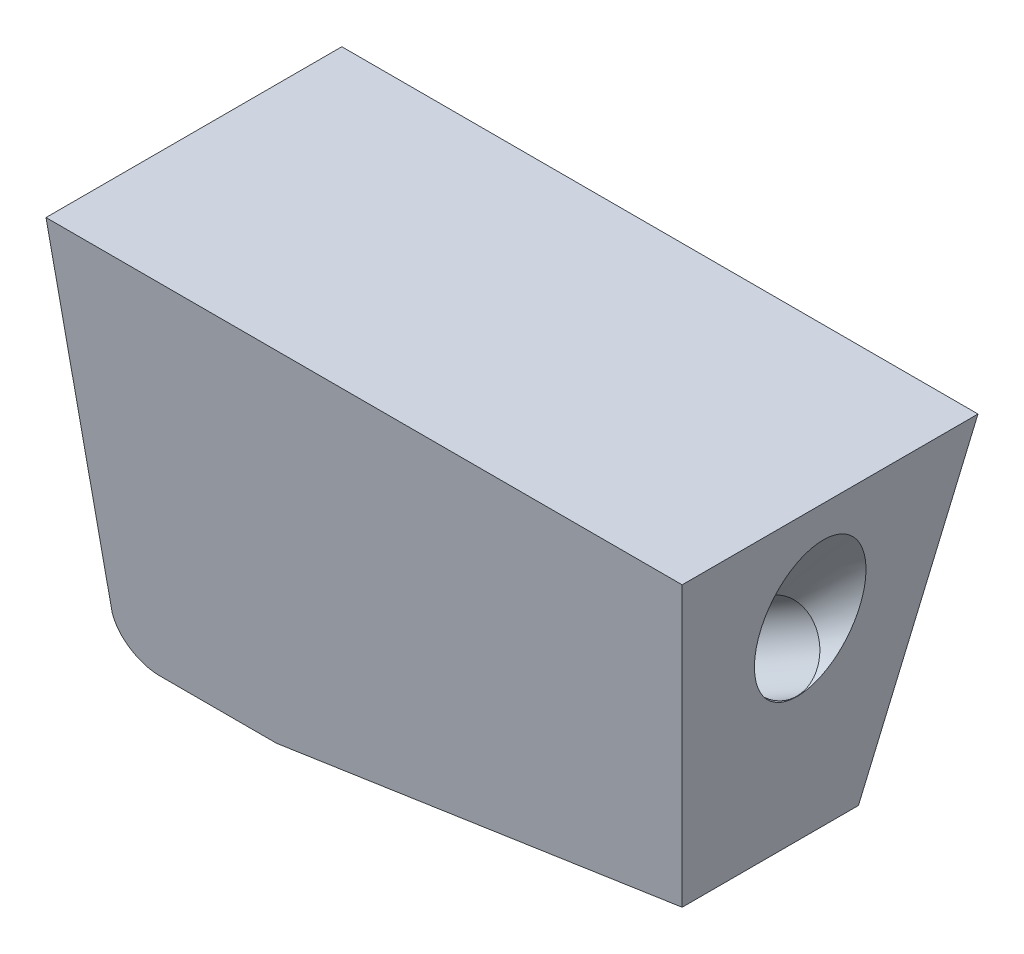
ISO-10303-21;
HEADER;
FILE_DESCRIPTION(('STEP AP214'),'2;1');
FILE_NAME('part.step','',(''),(''),'','','');
FILE_SCHEMA(('AUTOMOTIVE_DESIGN { 1 0 10303 214 1 1 1 1 }'));
ENDSEC;
DATA;
#1=APPLICATION_CONTEXT('core data for automotive mechanical design processes');
#2=APPLICATION_PROTOCOL_DEFINITION('international standard','automotive_design',2000,#1);
#3=PRODUCT_CONTEXT('',#1,'mechanical');
#4=PRODUCT('Part','Part','',(#3));
#5=PRODUCT_RELATED_PRODUCT_CATEGORY('part','',(#4));
#6=PRODUCT_DEFINITION_FORMATION('','',#4);
#7=PRODUCT_DEFINITION_CONTEXT('part definition',#1,'design');
#8=PRODUCT_DEFINITION('design','',#6,#7);
#9=PRODUCT_DEFINITION_SHAPE('','',#8);
#10=(LENGTH_UNIT() NAMED_UNIT(*) SI_UNIT(.MILLI.,.METRE.));
#11=(NAMED_UNIT(*) PLANE_ANGLE_UNIT() SI_UNIT($,.RADIAN.));
#12=(NAMED_UNIT(*) SI_UNIT($,.STERADIAN.) SOLID_ANGLE_UNIT());
#13=UNCERTAINTY_MEASURE_WITH_UNIT(LENGTH_MEASURE(1.E-05),#10,'distance_accuracy_value','');
#14=(GEOMETRIC_REPRESENTATION_CONTEXT(3) GLOBAL_UNCERTAINTY_ASSIGNED_CONTEXT((#13)) GLOBAL_UNIT_ASSIGNED_CONTEXT((#10,
#11,#12)) REPRESENTATION_CONTEXT('',''));
#15=CARTESIAN_POINT('',(0.,0.,0.));
#16=DIRECTION('',(0.,0.,1.));
#17=DIRECTION('',(1.,0.,0.));
#18=AXIS2_PLACEMENT_3D('',#15,#16,#17);
#19=CARTESIAN_POINT('',(38.0505893023531,0.,0.0508));
#20=DIRECTION('',(0.,-0.173648177666931,0.984807753012208));
#21=DIRECTION('',(0.,-0.984807753012208,-0.173648177666931));
#22=AXIS2_PLACEMENT_3D('',#19,#20,#21);
#23=PLANE('',#22);
#24=DIRECTION('',(-0.171087869746036,-0.970287525247814,-0.171087869746036));
#25=VECTOR('',#24,1.);
#26=CARTESIAN_POINT('',(1.11871235410314,6.31572292356323,1.16443235410315));
#27=LINE('',#26,#25);
#28=CARTESIAN_POINT('',(0.0543151661605584,0.279226502732241,0.100035166160561));
#29=VERTEX_POINT('',#28);
#30=CARTESIAN_POINT('',(0.013882623272793,0.0499221573319521,0.059602623272796));
#31=VERTEX_POINT('',#30);
#32=EDGE_CURVE('E433',#29,#31,#27,.T.);
#33=ORIENTED_EDGE('',*,*,#32,.F.);
#34=DIRECTION('',(-1.,0.,0.));
#35=VECTOR('',#34,1.);
#36=CARTESIAN_POINT('',(38.0505893023531,0.27922650273224,0.10003516616056));
#37=LINE('',#36,#35);
#38=CARTESIAN_POINT('',(-0.37592,0.279226502732242,0.100035166160561));
#39=VERTEX_POINT('',#38);
#40=EDGE_CURVE('E76',#29,#39,#37,.T.);
#41=ORIENTED_EDGE('',*,*,#40,.T.);
#42=DIRECTION('',(0.,0.984807753012208,0.173648177666931));
#43=VECTOR('',#42,1.);
#44=CARTESIAN_POINT('',(-0.37592,28.949469786949,5.15537260064367));
#45=LINE('',#44,#43);
#46=CARTESIAN_POINT('',(-0.37592,0.0255594358987837,0.0553068181606449));
#47=VERTEX_POINT('',#46);
#48=EDGE_CURVE('E262',#47,#39,#45,.T.);
#49=ORIENTED_EDGE('',*,*,#48,.F.);
#50=CARTESIAN_POINT('',(-0.3480816,0.02794,0.0557265758409919));
#51=DIRECTION('',(0.,-0.173648177666931,0.984807753012208));
#52=DIRECTION('',(0.,-0.984807753012208,-0.173648177666931));
#53=AXIS2_PLACEMENT_3D('',#50,#51,#52);
#54=ELLIPSE('',#53,0.0283710195360877,0.02794);
#55=CARTESIAN_POINT('',(-0.3480816,0.,0.0507999999999974));
#56=VERTEX_POINT('',#55);
#57=EDGE_CURVE('E219',#56,#47,#54,.F.);
#58=ORIENTED_EDGE('',*,*,#57,.F.);
#59=DIRECTION('',(-1.,0.,0.));
#60=VECTOR('',#59,1.);
#61=CARTESIAN_POINT('',(38.0505893023531,0.,0.0508));
#62=LINE('',#61,#60);
#63=CARTESIAN_POINT('',(-0.269239999999993,0.,0.0508));
#64=VERTEX_POINT('',#63);
#65=EDGE_CURVE('E437',#64,#56,#62,.T.);
#66=ORIENTED_EDGE('',*,*,#65,.F.);
#67=DIRECTION('',(-0.984346441568213,-0.173566836012845,-0.0306045161452665));
#68=VECTOR('',#67,1.);
#69=CARTESIAN_POINT('',(36.8602955850907,6.54693890482659,1.20520196997086));
#70=LINE('',#69,#68);
#71=EDGE_CURVE('E435',#31,#64,#70,.T.);
#72=ORIENTED_EDGE('',*,*,#71,.F.);
#73=EDGE_LOOP('',(#33,#41,#49,#58,#66,#72));
#74=FACE_BOUND('',#73,.T.);
#75=ADVANCED_FACE('F47',(#74),#23,.T.);
#76=CARTESIAN_POINT('',(38.0505893023531,0.,-0.0508));
#77=DIRECTION('',(0.,-0.173648177666931,-0.984807753012208));
#78=DIRECTION('',(0.,0.984807753012208,-0.173648177666931));
#79=AXIS2_PLACEMENT_3D('',#76,#77,#78);
#80=PLANE('',#79);
#81=DIRECTION('',(0.,-0.984807753012208,0.173648177666931));
#82=VECTOR('',#81,1.);
#83=CARTESIAN_POINT('',(-0.37592,29.2239341047245,-5.20376806510924));
#84=LINE('',#83,#82);
#85=CARTESIAN_POINT('',(-0.37592,0.279226502732242,-0.10003516616056));
#86=VERTEX_POINT('',#85);
#87=CARTESIAN_POINT('',(-0.37592,0.0255594358987803,-0.055306818160644));
#88=VERTEX_POINT('',#87);
#89=EDGE_CURVE('E55',#86,#88,#84,.T.);
#90=ORIENTED_EDGE('',*,*,#89,.F.);
#91=DIRECTION('',(1.,0.,0.));
#92=VECTOR('',#91,1.);
#93=CARTESIAN_POINT('',(38.0505893023531,0.27922650273224,-0.10003516616056));
#94=LINE('',#93,#92);
#95=CARTESIAN_POINT('',(0.0543151661605583,0.279226502732241,-0.100035166160561));
#96=VERTEX_POINT('',#95);
#97=EDGE_CURVE('E190',#86,#96,#94,.T.);
#98=ORIENTED_EDGE('',*,*,#97,.T.);
#99=DIRECTION('',(0.171087869746036,0.970287525247814,-0.171087869746036));
#100=VECTOR('',#99,1.);
#101=CARTESIAN_POINT('',(1.11871235410314,6.31572292356323,-1.16443235410315));
#102=LINE('',#101,#100);
#103=CARTESIAN_POINT('',(0.013882623272793,0.0499221573319521,-0.059602623272796));
#104=VERTEX_POINT('',#103);
#105=EDGE_CURVE('E179',#104,#96,#102,.T.);
#106=ORIENTED_EDGE('',*,*,#105,.F.);
#107=DIRECTION('',(0.984346441568213,0.173566836012845,-0.0306045161452665));
#108=VECTOR('',#107,1.);
#109=CARTESIAN_POINT('',(36.8602955850907,6.54693890482659,-1.20520196997086));
#110=LINE('',#109,#108);
#111=CARTESIAN_POINT('',(-0.269239999999993,0.,-0.0508));
#112=VERTEX_POINT('',#111);
#113=EDGE_CURVE('E187',#112,#104,#110,.T.);
#114=ORIENTED_EDGE('',*,*,#113,.F.);
#115=DIRECTION('',(-1.,0.,0.));
#116=VECTOR('',#115,1.);
#117=CARTESIAN_POINT('',(38.0505893023531,0.,-0.0508));
#118=LINE('',#117,#116);
#119=CARTESIAN_POINT('',(-0.3480816,0.,-0.0507999999999974));
#120=VERTEX_POINT('',#119);
#121=EDGE_CURVE('E264',#112,#120,#118,.T.);
#122=ORIENTED_EDGE('',*,*,#121,.T.);
#123=CARTESIAN_POINT('',(-0.3480816,0.02794,-0.0557265758409919));
#124=DIRECTION('',(0.,-0.173648177666931,-0.984807753012208));
#125=DIRECTION('',(0.,0.984807753012208,-0.173648177666931));
#126=AXIS2_PLACEMENT_3D('',#123,#124,#125);
#127=ELLIPSE('',#126,0.0283710195360877,0.02794);
#128=EDGE_CURVE('E216',#88,#120,#127,.F.);
#129=ORIENTED_EDGE('',*,*,#128,.F.);
#130=EDGE_LOOP('',(#90,#98,#106,#114,#122,#129));
#131=FACE_BOUND('',#130,.T.);
#132=ADVANCED_FACE('F191',(#131),#80,.T.);
#133=CARTESIAN_POINT('',(-0.37592,29.999999944,-0.80247998));
#134=DIRECTION('',(-1.,0.,0.));
#135=DIRECTION('',(0.,0.,1.));
#136=AXIS2_PLACEMENT_3D('',#133,#134,#135);
#137=PLANE('',#136);
#138=ORIENTED_EDGE('',*,*,#48,.T.);
#139=DIRECTION('',(0.,0.,-1.));
#140=VECTOR('',#139,1.);
#141=CARTESIAN_POINT('',(-0.37592,0.279226502732242,-0.80247998));
#142=LINE('',#141,#140);
#143=EDGE_CURVE('E68',#39,#86,#142,.T.);
#144=ORIENTED_EDGE('',*,*,#143,.T.);
#145=ORIENTED_EDGE('',*,*,#89,.T.);
#146=DIRECTION('',(0.,0.,-1.));
#147=VECTOR('',#146,1.);
#148=CARTESIAN_POINT('',(-0.37592,0.0255594358987817,37.5951067577949));
#149=LINE('',#148,#147);
#150=CARTESIAN_POINT('',(-0.375920000000905,0.0255596464523181,-0.0113540778486097));
#151=VERTEX_POINT('',#150);
#152=EDGE_CURVE('E202',#151,#88,#149,.T.);
#153=ORIENTED_EDGE('',*,*,#152,.F.);
#154=CARTESIAN_POINT('',(-0.37592,0.,0.0380414061969188));
#155=CARTESIAN_POINT('',(-0.37592,0.0144525311347559,0.0275806498206756));
#156=CARTESIAN_POINT('',(-0.37592,0.0284500319999992,0.0140880799781967));
#157=CARTESIAN_POINT('',(-0.37592,0.0284500319999992,-0.014088079978197));
#158=CARTESIAN_POINT('',(-0.37592,0.0144525311347538,-0.0275806498206756));
#159=CARTESIAN_POINT('',(-0.37592,0.,-0.038041406196919));
#160=(BOUNDED_CURVE() B_SPLINE_CURVE(3,(#154,#155,#156,#157,#158,#159),.UNSPECIFIED.,.F.,
.F.) B_SPLINE_CURVE_WITH_KNOTS((4,2,4),(1.41078533369424,1.5707963267949,1.73080731989555),
.UNSPECIFIED.) CURVE() GEOMETRIC_REPRESENTATION_ITEM() RATIONAL_B_SPLINE_CURVE((1.,1.,1.,1.,1.,1.)) REPRESENTATION_ITEM(''));
#161=CARTESIAN_POINT('',(-0.375920000000232,0.0255596719080658,0.0115076811886463));
#162=VERTEX_POINT('',#161);
#163=EDGE_CURVE('E493',#151,#162,#160,.F.);
#164=ORIENTED_EDGE('',*,*,#163,.T.);
#165=EDGE_CURVE('E211',#47,#162,#149,.T.);
#166=ORIENTED_EDGE('',*,*,#165,.F.);
#167=EDGE_LOOP('',(#138,#144,#145,#153,#164,#166));
#168=FACE_BOUND('',#167,.T.);
#169=ADVANCED_FACE('F332',(#168),#137,.T.);
#170=CARTESIAN_POINT('',(0.0138826232727961,0.0499221573319526,38.4527456938784));
#171=DIRECTION('',(-0.984807753012208,0.173648177666931,0.));
#172=DIRECTION('',(-0.173648177666931,-0.984807753012208,0.));
#173=AXIS2_PLACEMENT_3D('',#170,#171,#172);
#174=PLANE('',#173);
#175=CARTESIAN_POINT('',(0.0408608715396788,0.202923406253057,0.));
#176=DIRECTION('',(-0.984807753012208,0.173648177666931,0.));
#177=DIRECTION('',(0.173648177666931,0.984807753012208,0.));
#178=AXIS2_PLACEMENT_3D('',#175,#176,#177);
#179=ELLIPSE('',#178,0.0510507152050235,0.0366689973897192);
#180=CARTESIAN_POINT('',(0.0497257352036246,0.253198546383783,0.));
#181=VERTEX_POINT('',#180);
#182=EDGE_CURVE('E272',#181,#181,#179,.F.);
#183=ORIENTED_EDGE('',*,*,#182,.F.);
#184=EDGE_LOOP('',(#183));
#185=FACE_BOUND('',#184,.T.);
#186=DIRECTION('',(0.,0.,-1.));
#187=VECTOR('',#186,1.);
#188=CARTESIAN_POINT('',(0.0543151661605599,0.27922650273224,38.4527456938784));
#189=LINE('',#188,#187);
#190=EDGE_CURVE('E13',#29,#96,#189,.T.);
#191=ORIENTED_EDGE('',*,*,#190,.F.);
#192=ORIENTED_EDGE('',*,*,#32,.T.);
#193=DIRECTION('',(0.,0.,-1.));
#194=VECTOR('',#193,1.);
#195=CARTESIAN_POINT('',(0.0138826232727961,0.0499221573319526,38.4527456938784));
#196=LINE('',#195,#194);
#197=EDGE_CURVE('E183',#31,#104,#196,.T.);
#198=ORIENTED_EDGE('',*,*,#197,.T.);
#199=ORIENTED_EDGE('',*,*,#105,.T.);
#200=EDGE_LOOP('',(#191,#192,#198,#199));
#201=FACE_BOUND('',#200,.T.);
#202=ADVANCED_FACE('F181',(#185,#201),#174,.F.);
#203=CARTESIAN_POINT('',(-0.29337,0.,0.0254));
#204=DIRECTION('',(0.866025403784436,-0.500000000000004,0.));
#205=DIRECTION('',(0.500000000000004,0.866025403784436,0.));
#206=AXIS2_PLACEMENT_3D('',#203,#204,#205);
#207=PLANE('',#206);
#208=DIRECTION('',(0.,0.,1.));
#209=VECTOR('',#208,1.);
#210=CARTESIAN_POINT('',(-0.288032486856643,0.0092448439503614,-0.00635));
#211=LINE('',#210,#209);
#212=CARTESIAN_POINT('',(-0.288032486856643,0.0092448439503614,-0.00635));
#213=VERTEX_POINT('',#212);
#214=CARTESIAN_POINT('',(-0.288032486856643,0.0092448439503614,0.00635));
#215=VERTEX_POINT('',#214);
#216=EDGE_CURVE('E463',#213,#215,#211,.T.);
#217=ORIENTED_EDGE('',*,*,#216,.F.);
#218=DIRECTION('',(-0.500000000000004,-0.866025403784436,0.));
#219=VECTOR('',#218,1.);
#220=CARTESIAN_POINT('',(-0.29337,0.,-0.00635));
#221=LINE('',#220,#219);
#222=CARTESIAN_POINT('',(-0.291657824144469,0.00296557557327858,-0.00635));
#223=VERTEX_POINT('',#222);
#224=EDGE_CURVE('E455',#213,#223,#221,.T.);
#225=ORIENTED_EDGE('',*,*,#224,.T.);
#226=CARTESIAN_POINT('',(-0.429457213475481,-0.235709968,0.));
#227=DIRECTION('',(0.866025403784436,-0.500000000000004,0.));
#228=DIRECTION('',(-0.500000000000004,-0.866025403784436,0.));
#229=AXIS2_PLACEMENT_3D('',#226,#227,#228);
#230=ELLIPSE('',#229,0.275696300543431,0.23876);
#231=CARTESIAN_POINT('',(-0.292391319833041,0.00169512377353312,-0.0254));
#232=VERTEX_POINT('',#231);
#233=EDGE_CURVE('E284',#232,#223,#230,.T.);
#234=ORIENTED_EDGE('',*,*,#233,.F.);
#235=DIRECTION('',(-0.500000000000004,-0.866025403784436,0.));
#236=VECTOR('',#235,1.);
#237=CARTESIAN_POINT('',(-0.29337,0.,-0.0254));
#238=LINE('',#237,#236);
#239=CARTESIAN_POINT('',(-0.239110621701558,0.0939800000000001,-0.0254));
#240=VERTEX_POINT('',#239);
#241=EDGE_CURVE('E422',#240,#232,#238,.T.);
#242=ORIENTED_EDGE('',*,*,#241,.F.);
#243=DIRECTION('',(0.,0.,-1.));
#244=VECTOR('',#243,1.);
#245=CARTESIAN_POINT('',(-0.239110621701558,0.0939800000000001,0.0254));
#246=LINE('',#245,#244);
#247=CARTESIAN_POINT('',(-0.239110621701558,0.0939800000000001,0.0254));
#248=VERTEX_POINT('',#247);
#249=EDGE_CURVE('E275',#248,#240,#246,.T.);
#250=ORIENTED_EDGE('',*,*,#249,.F.);
#251=DIRECTION('',(-0.500000000000004,-0.866025403784436,0.));
#252=VECTOR('',#251,1.);
#253=CARTESIAN_POINT('',(-0.29337,0.,0.0254));
#254=LINE('',#253,#252);
#255=CARTESIAN_POINT('',(-0.292391319833041,0.00169512377353312,0.0254));
#256=VERTEX_POINT('',#255);
#257=EDGE_CURVE('E414',#248,#256,#254,.T.);
#258=ORIENTED_EDGE('',*,*,#257,.T.);
#259=CARTESIAN_POINT('',(-0.291657824144469,0.00296557557327858,0.00635));
#260=VERTEX_POINT('',#259);
#261=EDGE_CURVE('E283',#260,#256,#230,.T.);
#262=ORIENTED_EDGE('',*,*,#261,.F.);
#263=DIRECTION('',(-0.500000000000004,-0.866025403784436,0.));
#264=VECTOR('',#263,1.);
#265=CARTESIAN_POINT('',(-0.29337,0.,0.00635));
#266=LINE('',#265,#264);
#267=EDGE_CURVE('E460',#215,#260,#266,.T.);
#268=ORIENTED_EDGE('',*,*,#267,.F.);
#269=EDGE_LOOP('',(#217,#225,#234,#242,#250,#258,#262,#268));
#270=FACE_BOUND('',#269,.T.);
#271=ADVANCED_FACE('F363',(#270),#207,.T.);
#272=CARTESIAN_POINT('',(37.9172393023531,-0.235709968,0.));
#273=DIRECTION('',(-1.,0.,0.));
#274=DIRECTION('',(0.,0.,1.));
#275=AXIS2_PLACEMENT_3D('',#272,#273,#274);
#276=CYLINDRICAL_SURFACE('',#275,0.23876);
#277=DIRECTION('',(-1.,0.,0.));
#278=VECTOR('',#277,1.);
#279=CARTESIAN_POINT('',(37.9172393023531,0.,0.0380414061969188));
#280=LINE('',#279,#278);
#281=CARTESIAN_POINT('',(-0.26924,0.,0.0380414061969328));
#282=VERTEX_POINT('',#281);
#283=CARTESIAN_POINT('',(-0.348081600000001,0.,0.0380414061969189));
#284=VERTEX_POINT('',#283);
#285=EDGE_CURVE('E299',#282,#284,#280,.T.);
#286=ORIENTED_EDGE('',*,*,#285,.T.);
#287=CARTESIAN_POINT('',(-0.3480816,0.,0.0380414061969188));
#288=CARTESIAN_POINT('',(-0.348370297249881,-1.57473913094452E-07,0.0380422867495793));
#289=CARTESIAN_POINT('',(-0.348657740094899,4.46809397733516E-06,0.0380137267014361));
#290=CARTESIAN_POINT('',(-0.349218887029546,2.18064433425661E-05,0.0379061055838232));
#291=CARTESIAN_POINT('',(-0.349492724840044,3.44083287340178E-05,0.0378277369505647));
#292=CARTESIAN_POINT('',(-0.350087059114706,7.00964341791643E-05,0.0376046986053117));
#293=CARTESIAN_POINT('',(-0.350403088810441,9.49673206046473E-05,0.0374486675593185));
#294=CARTESIAN_POINT('',(-0.351006970235381,0.000151905184797741,0.0370883847614802));
#295=CARTESIAN_POINT('',(-0.351294652771117,0.000184012004650592,0.036883865690612));
#296=CARTESIAN_POINT('',(-0.352028776233906,0.000276294124554952,0.0362899601536919));
#297=CARTESIAN_POINT('',(-0.352449418385566,0.000340660694436656,0.0358697272673334));
#298=CARTESIAN_POINT('',(-0.353225932848081,0.000474891774519048,0.0349751304448968));
#299=CARTESIAN_POINT('',(-0.353581667371428,0.000544767539923122,0.034500654753102));
#300=CARTESIAN_POINT('',(-0.354806983366323,0.000805664825619692,0.0326871096256259));
#301=CARTESIAN_POINT('',(-0.355523812901215,0.00100099119137988,0.0312475495296627));
#302=CARTESIAN_POINT('',(-0.356756481320225,0.00137374562286157,0.0282836130517373));
#303=CARTESIAN_POINT('',(-0.357271067728808,0.00155105726413036,0.0267587729336342));
#304=CARTESIAN_POINT('',(-0.358984388303717,0.00217715184867487,0.0208575211290827));
#305=CARTESIAN_POINT('',(-0.359724634901563,0.00253296209976583,0.0163401332990547));
#306=CARTESIAN_POINT('',(-0.360649680189473,0.00298440192897113,0.00724301122279436));
#307=CARTESIAN_POINT('',(-0.360832500485171,0.00307910468161393,0.00266311272708323));
#308=CARTESIAN_POINT('',(-0.360698041243689,0.00301061173586352,-0.00586876642304038));
#309=CARTESIAN_POINT('',(-0.36044514102484,0.00288060829416939,-0.00982177938728517));
#310=CARTESIAN_POINT('',(-0.359491898998143,0.00242887100320888,-0.0176448861764567));
#311=CARTESIAN_POINT('',(-0.358794873864542,0.0021085595402366,-0.021515376688691));
#312=CARTESIAN_POINT('',(-0.357222430963112,0.00153295180831518,-0.0269242607235509));
#313=CARTESIAN_POINT('',(-0.356664973165378,0.00134153533633056,-0.0285559425380455));
#314=CARTESIAN_POINT('',(-0.355595494923302,0.00102631943173864,-0.0310338022217961));
#315=CARTESIAN_POINT('',(-0.355166851267188,0.000908802026046567,-0.0319162751728795));
#316=CARTESIAN_POINT('',(-0.354198192038508,0.000673078002672362,-0.0336171714865279));
#317=CARTESIAN_POINT('',(-0.353658727146443,0.000554877499001803,-0.0344358849448356));
#318=CARTESIAN_POINT('',(-0.352792473999132,0.000398932412591014,-0.0354826265763768));
#319=CARTESIAN_POINT('',(-0.352535684202114,0.000355948704027794,-0.0357672474222327));
#320=CARTESIAN_POINT('',(-0.351991047696761,0.000273479004891516,-0.0363073571268736));
#321=CARTESIAN_POINT('',(-0.351703144323672,0.000233999642937708,-0.0365627910288029));
#322=CARTESIAN_POINT('',(-0.35108793464418,0.000160455666459456,-0.0370342917065393));
#323=CARTESIAN_POINT('',(-0.350760075059589,0.000126487029396559,-0.0372496686651115));
#324=CARTESIAN_POINT('',(-0.350069414087339,6.86840470784521E-05,-0.0376138150256087));
#325=CARTESIAN_POINT('',(-0.349706859083061,4.47839288315495E-05,-0.0377630170672981));
#326=CARTESIAN_POINT('',(-0.349129320182638,1.8915398594351E-05,-0.0379240631580032));
#327=CARTESIAN_POINT('',(-0.348923259579573,1.19156993312165E-05,-0.0379675207414632));
#328=CARTESIAN_POINT('',(-0.348505477733543,2.41659635047184E-06,-0.03802643348229));
#329=CARTESIAN_POINT('',(-0.348293724939053,-4.74009174678995E-08,-0.0380416683341019));
#330=CARTESIAN_POINT('',(-0.348081600002118,-4.88028125320799E-13,-0.0380414062044368));
#331=B_SPLINE_CURVE_WITH_KNOTS('',3,(#287,#288,#289,#290,#291,#292,#293,#294,#295,#296,#297,
#298,#299,#300,#301,#302,#303,#304,#305,#306,#307,#308,#309,#310,#311,#312,#313,#314,#315,#316,
#317,#318,#319,#320,#321,#322,#323,#324,#325,#326,#327,#328,#329,#330),.UNSPECIFIED.,.F.,.F.,(4,
2,2,2,2,2,2,2,2,2,2,2,2,2,2,2,2,2,2,2,2,4),(0.,0.00086262961666917,0.00171352175331503,
0.00276753746066433,0.00382750502025348,0.00561156625222818,0.00739937175537492,
0.0122218634154351,0.0170737667410356,0.0307525437377263,0.0444798127023014,0.0563478770749282,
0.0681283345815422,0.0733182116250238,0.0762783450561242,0.0792241104656409,0.0803796142217476,
0.081537259050029,0.0827132934559175,0.0838815215489419,0.0845118039055874,0.0851469858208381),.UNSPECIFIED.);
#332=CARTESIAN_POINT('',(-0.358997429580619,0.00222774432347758,0.0197940895484524));
#333=VERTEX_POINT('',#332);
#334=EDGE_CURVE('E215',#284,#333,#331,.T.);
#335=ORIENTED_EDGE('',*,*,#334,.T.);
#336=CARTESIAN_POINT('',(-0.37592,0.,-0.038041406196919));
#337=CARTESIAN_POINT('',(-0.363217112126546,0.00202856108150116,-0.0254721529697494));
#338=CARTESIAN_POINT('',(-0.35052,0.003050032,-0.0127347043389898));
#339=CARTESIAN_POINT('',(-0.35052,0.00305003200000001,0.0127347043389896));
#340=CARTESIAN_POINT('',(-0.363217112126546,0.00202856108150119,0.0254721529697492));
#341=CARTESIAN_POINT('',(-0.37592,0.,0.0380414061969188));
#342=(BOUNDED_CURVE() B_SPLINE_CURVE(3,(#336,#337,#338,#339,#340,#341),.UNSPECIFIED.,.F.,
.F.) B_SPLINE_CURVE_WITH_KNOTS((4,2,4),(1.41078533369424,1.5707963267949,1.73080731989555),
.UNSPECIFIED.) CURVE() GEOMETRIC_REPRESENTATION_ITEM() RATIONAL_B_SPLINE_CURVE((1.,1.,1.,1.,1.,1.)) REPRESENTATION_ITEM(''));
#343=CARTESIAN_POINT('',(-0.35899740442078,0.00222774394011601,-0.0197940941611509));
#344=VERTEX_POINT('',#343);
#345=EDGE_CURVE('E295',#333,#344,#342,.F.);
#346=ORIENTED_EDGE('',*,*,#345,.T.);
#347=CARTESIAN_POINT('',(-0.348081600000001,0.,-0.0380414061969189));
#348=VERTEX_POINT('',#347);
#349=EDGE_CURVE('E205',#344,#348,#331,.T.);
#350=ORIENTED_EDGE('',*,*,#349,.T.);
#351=DIRECTION('',(-1.,0.,0.));
#352=VECTOR('',#351,1.);
#353=CARTESIAN_POINT('',(37.9172393023531,0.,-0.0380414061969189));
#354=LINE('',#353,#352);
#355=CARTESIAN_POINT('',(-0.26924,0.,-0.0380414061969189));
#356=VERTEX_POINT('',#355);
#357=EDGE_CURVE('E451',#356,#348,#354,.T.);
#358=ORIENTED_EDGE('',*,*,#357,.F.);
#359=CARTESIAN_POINT('',(-1.60601765622106,-0.235709968,0.));
#360=DIRECTION('',(-0.173648177666931,0.984807753012208,0.));
#361=DIRECTION('',(-0.984807753012208,-0.173648177666931,0.));
#362=AXIS2_PLACEMENT_3D('',#359,#360,#361);
#363=ELLIPSE('',#362,1.37496404055537,0.23876);
#364=CARTESIAN_POINT('',(-0.259626475361104,0.00169512377353837,-0.0254000000000009));
#365=VERTEX_POINT('',#364);
#366=EDGE_CURVE('E404',#365,#356,#363,.T.);
#367=ORIENTED_EDGE('',*,*,#366,.F.);
#368=DIRECTION('',(-1.,0.,0.));
#369=VECTOR('',#368,1.);
#370=CARTESIAN_POINT('',(37.9172393023531,0.00169512377353378,-0.0254));
#371=LINE('',#370,#369);
#372=EDGE_CURVE('E452',#232,#365,#371,.F.);
#373=ORIENTED_EDGE('',*,*,#372,.F.);
#374=ORIENTED_EDGE('',*,*,#233,.T.);
#375=DIRECTION('',(-1.,0.,0.));
#376=VECTOR('',#375,1.);
#377=CARTESIAN_POINT('',(37.9172393023531,0.00296557557327858,-0.00635));
#378=LINE('',#377,#376);
#379=CARTESIAN_POINT('',(-0.305284634933358,0.00296557557328143,-0.00635));
#380=VERTEX_POINT('',#379);
#381=EDGE_CURVE('E293',#380,#223,#378,.F.);
#382=ORIENTED_EDGE('',*,*,#381,.F.);
#383=CARTESIAN_POINT('',(-0.961040301477027,-0.235709968,0.));
#384=DIRECTION('',(-0.342020143325664,0.93969262078591,0.));
#385=DIRECTION('',(-0.93969262078591,-0.342020143325664,0.));
#386=AXIS2_PLACEMENT_3D('',#383,#384,#385);
#387=ELLIPSE('',#386,0.698087538582949,0.23876);
#388=CARTESIAN_POINT('',(-0.305284634933358,0.00296557557328143,0.00635));
#389=VERTEX_POINT('',#388);
#390=EDGE_CURVE('E290',#380,#389,#387,.F.);
#391=ORIENTED_EDGE('',*,*,#390,.T.);
#392=DIRECTION('',(-1.,0.,0.));
#393=VECTOR('',#392,1.);
#394=CARTESIAN_POINT('',(37.9172393023531,0.00296557557327858,0.00635));
#395=LINE('',#394,#393);
#396=EDGE_CURVE('E287',#389,#260,#395,.F.);
#397=ORIENTED_EDGE('',*,*,#396,.T.);
#398=ORIENTED_EDGE('',*,*,#261,.T.);
#399=DIRECTION('',(-1.,0.,0.));
#400=VECTOR('',#399,1.);
#401=CARTESIAN_POINT('',(37.9172393023531,0.00169512377353378,0.0254));
#402=LINE('',#401,#400);
#403=CARTESIAN_POINT('',(-0.259626475361104,0.00169512377353837,0.0254000000000009));
#404=VERTEX_POINT('',#403);
#405=EDGE_CURVE('E453',#256,#404,#402,.F.);
#406=ORIENTED_EDGE('',*,*,#405,.T.);
#407=EDGE_CURVE('E399',#282,#404,#363,.T.);
#408=ORIENTED_EDGE('',*,*,#407,.F.);
#409=EDGE_LOOP('',(#286,#335,#346,#350,#358,#367,#373,#374,#382,#391,#397,#398,#406,#408));
#410=FACE_BOUND('',#409,.T.);
#411=ADVANCED_FACE('F229',(#410),#276,.F.);
#412=CARTESIAN_POINT('',(0.,0.,0.));
#413=DIRECTION('',(0.,1.,0.));
#414=DIRECTION('',(0.,0.,1.));
#415=AXIS2_PLACEMENT_3D('',#412,#413,#414);
#416=PLANE('',#415);
#417=ORIENTED_EDGE('',*,*,#65,.T.);
#418=DIRECTION('',(0.,0.,-1.));
#419=VECTOR('',#418,1.);
#420=CARTESIAN_POINT('',(-0.3480816,0.,37.5951067577949));
#421=LINE('',#420,#419);
#422=EDGE_CURVE('E201',#56,#284,#421,.T.);
#423=ORIENTED_EDGE('',*,*,#422,.T.);
#424=ORIENTED_EDGE('',*,*,#285,.F.);
#425=DIRECTION('',(0.,0.,-1.));
#426=VECTOR('',#425,1.);
#427=CARTESIAN_POINT('',(-0.26924,0.,38.4527456938784));
#428=LINE('',#427,#426);
#429=EDGE_CURVE('E430',#64,#282,#428,.T.);
#430=ORIENTED_EDGE('',*,*,#429,.F.);
#431=EDGE_LOOP('',(#417,#423,#424,#430));
#432=FACE_BOUND('',#431,.T.);
#433=ADVANCED_FACE('F345',(#432),#416,.F.);
#434=ORIENTED_EDGE('',*,*,#357,.T.);
#435=EDGE_CURVE('E197',#348,#120,#421,.T.);
#436=ORIENTED_EDGE('',*,*,#435,.T.);
#437=ORIENTED_EDGE('',*,*,#121,.F.);
#438=EDGE_CURVE('E429',#356,#112,#428,.T.);
#439=ORIENTED_EDGE('',*,*,#438,.F.);
#440=EDGE_LOOP('',(#434,#436,#437,#439));
#441=FACE_BOUND('',#440,.T.);
#442=ADVANCED_FACE('F342',(#441),#416,.F.);
#443=CARTESIAN_POINT('',(-0.26924,0.,38.4527456938784));
#444=DIRECTION('',(-0.173648177666931,0.984807753012208,0.));
#445=DIRECTION('',(-0.984807753012208,-0.173648177666931,0.));
#446=AXIS2_PLACEMENT_3D('',#443,#444,#445);
#447=PLANE('',#446);
#448=ORIENTED_EDGE('',*,*,#429,.T.);
#449=ORIENTED_EDGE('',*,*,#407,.T.);
#450=DIRECTION('',(-0.984807753012208,-0.173648177666931,0.));
#451=VECTOR('',#450,1.);
#452=CARTESIAN_POINT('',(-0.26924,0.,0.0254000000000018));
#453=LINE('',#452,#451);
#454=CARTESIAN_POINT('',(-0.12065,0.026200426063471,0.0254000000000009));
#455=VERTEX_POINT('',#454);
#456=EDGE_CURVE('E280',#455,#404,#453,.T.);
#457=ORIENTED_EDGE('',*,*,#456,.F.);
#458=DIRECTION('',(0.,0.,1.));
#459=VECTOR('',#458,1.);
#460=CARTESIAN_POINT('',(-0.12065,0.026200426063471,38.4527456938784));
#461=LINE('',#460,#459);
#462=CARTESIAN_POINT('',(-0.12065,0.026200426063471,-0.0254000000000009));
#463=VERTEX_POINT('',#462);
#464=EDGE_CURVE('E278',#463,#455,#461,.T.);
#465=ORIENTED_EDGE('',*,*,#464,.F.);
#466=DIRECTION('',(-0.984807753012208,-0.173648177666931,0.));
#467=VECTOR('',#466,1.);
#468=CARTESIAN_POINT('',(-0.26924,0.,-0.0254000000000018));
#469=LINE('',#468,#467);
#470=EDGE_CURVE('E271',#463,#365,#469,.T.);
#471=ORIENTED_EDGE('',*,*,#470,.T.);
#472=ORIENTED_EDGE('',*,*,#366,.T.);
#473=ORIENTED_EDGE('',*,*,#438,.T.);
#474=ORIENTED_EDGE('',*,*,#113,.T.);
#475=ORIENTED_EDGE('',*,*,#197,.F.);
#476=ORIENTED_EDGE('',*,*,#71,.T.);
#477=EDGE_LOOP('',(#448,#449,#457,#465,#471,#472,#473,#474,#475,#476));
#478=FACE_BOUND('',#477,.T.);
#479=ADVANCED_FACE('F344',(#478),#447,.F.);
#480=CARTESIAN_POINT('',(-0.12065,0.0939800000000001,0.0254));
#481=DIRECTION('',(-1.,0.,0.));
#482=DIRECTION('',(0.,0.,1.));
#483=AXIS2_PLACEMENT_3D('',#480,#481,#482);
#484=PLANE('',#483);
#485=ORIENTED_EDGE('',*,*,#464,.T.);
#486=DIRECTION('',(0.,1.,0.));
#487=VECTOR('',#486,1.);
#488=CARTESIAN_POINT('',(-0.12065,0.0939800000000001,0.0254));
#489=LINE('',#488,#487);
#490=CARTESIAN_POINT('',(-0.12065,0.0939800000000001,0.0254));
#491=VERTEX_POINT('',#490);
#492=EDGE_CURVE('E418',#455,#491,#489,.T.);
#493=ORIENTED_EDGE('',*,*,#492,.T.);
#494=CARTESIAN_POINT('',(-0.12065,0.09398,0.));
#495=DIRECTION('',(1.,0.,0.));
#496=DIRECTION('',(0.,1.,0.));
#497=AXIS2_PLACEMENT_3D('',#494,#495,#496);
#498=ELLIPSE('',#497,0.0293293936748329,0.0254);
#499=CARTESIAN_POINT('',(-0.12065,0.0939800000000001,-0.0254000000000018));
#500=VERTEX_POINT('',#499);
#501=EDGE_CURVE('E402',#500,#491,#498,.F.);
#502=ORIENTED_EDGE('',*,*,#501,.F.);
#503=DIRECTION('',(0.,1.,0.));
#504=VECTOR('',#503,1.);
#505=CARTESIAN_POINT('',(-0.12065,0.0939800000000001,-0.0254));
#506=LINE('',#505,#504);
#507=EDGE_CURVE('E415',#463,#500,#506,.T.);
#508=ORIENTED_EDGE('',*,*,#507,.F.);
#509=EDGE_LOOP('',(#485,#493,#502,#508));
#510=FACE_BOUND('',#509,.T.);
#511=ADVANCED_FACE('F351',(#510),#484,.T.);
#512=CARTESIAN_POINT('',(0.,0.,0.0254));
#513=DIRECTION('',(0.,0.,-1.));
#514=DIRECTION('',(-1.,0.,0.));
#515=AXIS2_PLACEMENT_3D('',#512,#513,#514);
#516=PLANE('',#515);
#517=ORIENTED_EDGE('',*,*,#405,.F.);
#518=ORIENTED_EDGE('',*,*,#257,.F.);
#519=DIRECTION('',(-1.,0.,0.));
#520=VECTOR('',#519,1.);
#521=CARTESIAN_POINT('',(-0.239110621701558,0.0939800000000001,0.0254));
#522=LINE('',#521,#520);
#523=EDGE_CURVE('E411',#491,#248,#522,.T.);
#524=ORIENTED_EDGE('',*,*,#523,.F.);
#525=ORIENTED_EDGE('',*,*,#492,.F.);
#526=ORIENTED_EDGE('',*,*,#456,.T.);
#527=EDGE_LOOP('',(#517,#518,#524,#525,#526));
#528=FACE_BOUND('',#527,.T.);
#529=ADVANCED_FACE('F376',(#528),#516,.T.);
#530=CARTESIAN_POINT('',(0.,0.,-0.0254));
#531=DIRECTION('',(0.,0.,-1.));
#532=DIRECTION('',(-1.,0.,0.));
#533=AXIS2_PLACEMENT_3D('',#530,#531,#532);
#534=PLANE('',#533);
#535=ORIENTED_EDGE('',*,*,#241,.T.);
#536=ORIENTED_EDGE('',*,*,#372,.T.);
#537=ORIENTED_EDGE('',*,*,#470,.F.);
#538=ORIENTED_EDGE('',*,*,#507,.T.);
#539=DIRECTION('',(-1.,0.,0.));
#540=VECTOR('',#539,1.);
#541=CARTESIAN_POINT('',(-0.239110621701558,0.0939800000000001,-0.0254));
#542=LINE('',#541,#540);
#543=EDGE_CURVE('E410',#500,#240,#542,.T.);
#544=ORIENTED_EDGE('',*,*,#543,.T.);
#545=EDGE_LOOP('',(#535,#536,#537,#538,#544));
#546=FACE_BOUND('',#545,.T.);
#547=ADVANCED_FACE('F378',(#546),#534,.F.);
#548=CARTESIAN_POINT('',(0.0189986001948874,0.174606156914472,0.));
#549=DIRECTION('',(0.866025403784441,0.499999999999995,0.));
#550=DIRECTION('',(-0.499999999999995,0.866025403784441,0.));
#551=AXIS2_PLACEMENT_3D('',#548,#549,#550);
#552=CONICAL_SURFACE('',#551,0.0254,0.392699081698725);
#553=CARTESIAN_POINT('',(0.0189986001948874,0.174606156914472,0.));
#554=DIRECTION('',(0.866025403784441,0.499999999999995,0.));
#555=DIRECTION('',(-0.499999999999995,0.866025403784441,0.));
#556=AXIS2_PLACEMENT_3D('',#553,#554,#555);
#557=CIRCLE('',#556,0.0254);
#558=CARTESIAN_POINT('',(0.00629860019488755,0.196603202170597,0.));
#559=VERTEX_POINT('',#558);
#560=EDGE_CURVE('E395',#559,#559,#557,.T.);
#561=ORIENTED_EDGE('',*,*,#560,.F.);
#562=EDGE_LOOP('',(#561));
#563=FACE_BOUND('',#562,.T.);
#564=ORIENTED_EDGE('',*,*,#182,.T.);
#565=EDGE_LOOP('',(#564));
#566=FACE_BOUND('',#565,.T.);
#567=ADVANCED_FACE('F369',(#563,#566),#552,.F.);
#568=CARTESIAN_POINT('',(-0.239110621701558,0.0939800000000001,0.0254));
#569=DIRECTION('',(0.,-1.,0.));
#570=DIRECTION('',(0.,0.,-1.));
#571=AXIS2_PLACEMENT_3D('',#568,#569,#570);
#572=PLANE('',#571);
#573=ORIENTED_EDGE('',*,*,#523,.T.);
#574=ORIENTED_EDGE('',*,*,#249,.T.);
#575=ORIENTED_EDGE('',*,*,#543,.F.);
#576=CARTESIAN_POINT('',(-0.12065,0.0939800000000001,0.));
#577=DIRECTION('',(0.,1.,0.));
#578=DIRECTION('',(1.,0.,0.));
#579=AXIS2_PLACEMENT_3D('',#576,#577,#578);
#580=ELLIPSE('',#579,0.0508000000000004,0.0254);
#581=EDGE_CURVE('E398',#491,#500,#580,.F.);
#582=ORIENTED_EDGE('',*,*,#581,.F.);
#583=EDGE_LOOP('',(#573,#574,#575,#582));
#584=FACE_BOUND('',#583,.T.);
#585=ADVANCED_FACE('F365',(#584),#572,.T.);
#586=CARTESIAN_POINT('',(-0.376753694095365,-0.0538815367264147,0.));
#587=DIRECTION('',(0.866025403784441,0.499999999999995,0.));
#588=DIRECTION('',(-0.499999999999995,0.866025403784441,0.));
#589=AXIS2_PLACEMENT_3D('',#586,#587,#588);
#590=CYLINDRICAL_SURFACE('',#589,0.0254);
#591=ORIENTED_EDGE('',*,*,#501,.T.);
#592=ORIENTED_EDGE('',*,*,#581,.T.);
#593=EDGE_LOOP('',(#591,#592));
#594=FACE_BOUND('',#593,.T.);
#595=ORIENTED_EDGE('',*,*,#560,.T.);
#596=EDGE_LOOP('',(#595));
#597=FACE_BOUND('',#596,.T.);
#598=ADVANCED_FACE('F368',(#594,#597),#590,.F.);
#599=CARTESIAN_POINT('',(-0.288032486856643,0.0092448439503614,-0.00635));
#600=DIRECTION('',(-0.342020143325664,0.93969262078591,0.));
#601=DIRECTION('',(-0.93969262078591,-0.342020143325664,0.));
#602=AXIS2_PLACEMENT_3D('',#599,#600,#601);
#603=PLANE('',#602);
#604=DIRECTION('',(-0.93969262078591,-0.342020143325664,0.));
#605=VECTOR('',#604,1.);
#606=CARTESIAN_POINT('',(-0.288032486856643,0.0092448439503614,-0.00635));
#607=LINE('',#606,#605);
#608=EDGE_CURVE('E488',#213,#380,#607,.T.);
#609=ORIENTED_EDGE('',*,*,#608,.F.);
#610=ORIENTED_EDGE('',*,*,#216,.T.);
#611=DIRECTION('',(-0.93969262078591,-0.342020143325664,0.));
#612=VECTOR('',#611,1.);
#613=CARTESIAN_POINT('',(-0.288032486856643,0.0092448439503614,0.00635));
#614=LINE('',#613,#612);
#615=EDGE_CURVE('E484',#215,#389,#614,.T.);
#616=ORIENTED_EDGE('',*,*,#615,.T.);
#617=ORIENTED_EDGE('',*,*,#390,.F.);
#618=EDGE_LOOP('',(#609,#610,#616,#617));
#619=FACE_BOUND('',#618,.T.);
#620=ADVANCED_FACE('F386',(#619),#603,.F.);
#621=CARTESIAN_POINT('',(0.,0.,-0.00635));
#622=DIRECTION('',(0.,0.,1.));
#623=DIRECTION('',(1.,0.,0.));
#624=AXIS2_PLACEMENT_3D('',#621,#622,#623);
#625=PLANE('',#624);
#626=ORIENTED_EDGE('',*,*,#608,.T.);
#627=ORIENTED_EDGE('',*,*,#381,.T.);
#628=ORIENTED_EDGE('',*,*,#224,.F.);
#629=EDGE_LOOP('',(#626,#627,#628));
#630=FACE_BOUND('',#629,.T.);
#631=ADVANCED_FACE('F240',(#630),#625,.T.);
#632=CARTESIAN_POINT('',(0.,0.,0.00635));
#633=DIRECTION('',(0.,0.,1.));
#634=DIRECTION('',(1.,0.,0.));
#635=AXIS2_PLACEMENT_3D('',#632,#633,#634);
#636=PLANE('',#635);
#637=ORIENTED_EDGE('',*,*,#267,.T.);
#638=ORIENTED_EDGE('',*,*,#396,.F.);
#639=ORIENTED_EDGE('',*,*,#615,.F.);
#640=EDGE_LOOP('',(#637,#638,#639));
#641=FACE_BOUND('',#640,.T.);
#642=ADVANCED_FACE('F483',(#641),#636,.F.);
#643=CARTESIAN_POINT('',(-0.37592,0.,0.0380414061969188));
#644=CARTESIAN_POINT('',(-0.363217112126546,0.00202856108150119,0.0254721529697492));
#645=CARTESIAN_POINT('',(-0.35052,0.00305003200000001,0.0127347043389896));
#646=CARTESIAN_POINT('',(-0.35052,0.003050032,-0.0127347043389898));
#647=CARTESIAN_POINT('',(-0.363217112126546,0.00202856108150116,-0.0254721529697494));
#648=CARTESIAN_POINT('',(-0.37592,0.,-0.038041406196919));
#649=CARTESIAN_POINT('',(-0.37592,0.,0.0380414061969188));
#650=CARTESIAN_POINT('',(-0.37592,0.00202901992435064,0.025469308445805));
#651=CARTESIAN_POINT('',(-0.375919999999999,0.00305003200000087,0.0127347043389901));
#652=CARTESIAN_POINT('',(-0.375919999999999,0.00305003199999945,-0.0127347043389903));
#653=CARTESIAN_POINT('',(-0.375920000000003,0.00202901992434701,-0.0254693084458045));
#654=CARTESIAN_POINT('',(-0.37592,0.,-0.038041406196919));
#655=CARTESIAN_POINT('',(-0.37592,0.,0.0380414061969188));
#656=CARTESIAN_POINT('',(-0.37592,0.0144525311347559,0.0275806498206756));
#657=CARTESIAN_POINT('',(-0.37592,0.0284500319999992,0.0140880799781967));
#658=CARTESIAN_POINT('',(-0.37592,0.0284500319999992,-0.014088079978197));
#659=CARTESIAN_POINT('',(-0.37592,0.0144525311347538,-0.0275806498206756));
#660=CARTESIAN_POINT('',(-0.37592,0.,-0.038041406196919));
#661=(BOUNDED_SURFACE() B_SPLINE_SURFACE(2,3,((#643,#644,#645,#646,#647,#648),(#649,#650,#651,
#652,#653,#654),(#655,#656,#657,#658,#659,#660)),.UNSPECIFIED.,.F.,.F.,
.F.) B_SPLINE_SURFACE_WITH_KNOTS((3,3),(4,2,4),(0.,1.),(1.41078533369424,1.5707963267949,
1.73080731989555),.UNSPECIFIED.) GEOMETRIC_REPRESENTATION_ITEM() RATIONAL_B_SPLINE_SURFACE(((1.,
1.,1.,1.,1.,1.),(0.707106781186548,0.707106781186548,0.707106781186561,0.707106781186561,
0.707106781186548,0.707106781186548),(1.,1.,1.,1.,1.,1.))) REPRESENTATION_ITEM('') SURFACE());
#662=CARTESIAN_POINT('',(-0.375920000000465,0.0255594359096906,0.0114298810777491));
#663=CARTESIAN_POINT('',(-0.375919153380561,0.0255882925944784,0.0110024186667435));
#664=CARTESIAN_POINT('',(-0.37591739909133,0.0255426423731346,0.0105283525690098));
#665=CARTESIAN_POINT('',(-0.375894686563542,0.0252550673592025,0.00946943729094619));
#666=CARTESIAN_POINT('',(-0.375867655471723,0.024954019600543,0.00889884155072851));
#667=CARTESIAN_POINT('',(-0.37573591215606,0.0239345775495176,0.00801920442559294));
#668=CARTESIAN_POINT('',(-0.375611297638372,0.0231218548836685,0.00783066454329395));
#669=CARTESIAN_POINT('',(-0.375295008890978,0.0215430562712214,0.00765542090903851));
#670=CARTESIAN_POINT('',(-0.375101345021647,0.02077925762023,0.00767526534947011));
#671=CARTESIAN_POINT('',(-0.374653283427806,0.0192724253333023,0.00778364836129734));
#672=CARTESIAN_POINT('',(-0.374399896519595,0.0185292544311935,0.00787109363053226));
#673=CARTESIAN_POINT('',(-0.373063320155339,0.0150880202606123,0.00836625596517662));
#674=CARTESIAN_POINT('',(-0.37159906431971,0.0125760194608422,0.00899777783323314));
#675=CARTESIAN_POINT('',(-0.367990006274163,0.00813642613417131,0.0106205298537192));
#676=CARTESIAN_POINT('',(-0.365834882769008,0.00621862553514346,0.0116172504992088));
#677=CARTESIAN_POINT('',(-0.362862615824611,0.0042059219018309,0.0137794153502529));
#678=CARTESIAN_POINT('',(-0.362010877251983,0.00370479737282723,0.0144932246622179));
#679=CARTESIAN_POINT('',(-0.360499965247837,0.00289664524575074,0.0162313349351399));
#680=CARTESIAN_POINT('',(-0.359842916931651,0.00259171993392196,0.0172588303835898));
#681=CARTESIAN_POINT('',(-0.359238550381176,0.00232354304953281,0.0188463312981743));
#682=CARTESIAN_POINT('',(-0.359101376899908,0.00226489541139424,0.0193226277679083));
#683=CARTESIAN_POINT('',(-0.359010490571947,0.00222613310164868,0.0198119731502758));
#684=B_SPLINE_CURVE_WITH_KNOTS('',3,(#662,#663,#664,#665,#666,#667,#668,#669,#670,#671,#672,
#673,#674,#675,#676,#677,#678,#679,#680,#681,#682,#683),.UNSPECIFIED.,.F.,.F.,(4,2,2,2,2,2,2,2,
2,2,4),(0.,0.00136409734232569,0.00317280013116597,0.00549578610011151,0.00789198173086611,
0.0102502144316011,0.0190285885992626,0.0279447506162135,0.0315664646490786,0.0352263663039617,
0.0367178342348419),.UNSPECIFIED.);
#685=EDGE_CURVE('E61',#162,#333,#684,.T.);
#686=CARTESIAN_POINT('',(-0.359010490571882,0.00222613310161622,-0.0198119731506587));
#687=CARTESIAN_POINT('',(-0.35917905688376,0.00229803192885648,-0.0188773801736229));
#688=CARTESIAN_POINT('',(-0.359512200814934,0.00244050897803614,-0.0180075411283829));
#689=CARTESIAN_POINT('',(-0.360395916852261,0.00285537036459639,-0.0164092985593377));
#690=CARTESIAN_POINT('',(-0.360947967202134,0.00312864058214771,-0.0156819079209948));
#691=CARTESIAN_POINT('',(-0.362591806025061,0.00403478253723053,-0.0139237387197701));
#692=CARTESIAN_POINT('',(-0.363783444498021,0.00478454194223421,-0.013059031373572));
#693=CARTESIAN_POINT('',(-0.366856955555272,0.00710870376254363,-0.0111330817365929));
#694=CARTESIAN_POINT('',(-0.368694464680791,0.008904093600744,-0.0102980783844401));
#695=CARTESIAN_POINT('',(-0.371902852975228,0.0130908006320816,-0.00886946024446405));
#696=CARTESIAN_POINT('',(-0.373250946849563,0.0155039405959411,-0.00828742936554947));
#697=CARTESIAN_POINT('',(-0.374500741832861,0.018812710725819,-0.00783597582281348));
#698=CARTESIAN_POINT('',(-0.374747923387554,0.0195616695458463,-0.00775446570957258));
#699=CARTESIAN_POINT('',(-0.375189248494955,0.0211218120156165,-0.00766649131226517));
#700=CARTESIAN_POINT('',(-0.375380698273726,0.0219342875396314,-0.00766335615991491));
#701=CARTESIAN_POINT('',(-0.37560100027687,0.0230963671263773,-0.00785822278181447));
#702=CARTESIAN_POINT('',(-0.375661246602075,0.0234536961593833,-0.00794605421054478));
#703=CARTESIAN_POINT('',(-0.375754827294611,0.0240777612377362,-0.0082097844951437));
#704=CARTESIAN_POINT('',(-0.375790912851588,0.0243498817724985,-0.00836953047781261));
#705=CARTESIAN_POINT('',(-0.375846926374762,0.0248115796936716,-0.00878296083010815));
#706=CARTESIAN_POINT('',(-0.375866971001176,0.0250017483244832,-0.00903594703855624));
#707=CARTESIAN_POINT('',(-0.375899055905885,0.0253192143629863,-0.00964735275986166));
#708=CARTESIAN_POINT('',(-0.375908285951973,0.0254227864615092,-0.010016690033739));
#709=CARTESIAN_POINT('',(-0.375917969301083,0.0255377608662104,-0.0107390163493487));
#710=CARTESIAN_POINT('',(-0.375919100466084,0.0255562340465302,-0.0110907360087637));
#711=CARTESIAN_POINT('',(-0.37592,0.0255594358972609,-0.0114298810195555));
#712=B_SPLINE_CURVE_WITH_KNOTS('',3,(#686,#687,#688,#689,#690,#691,#692,#693,#694,#695,#696,
#697,#698,#699,#700,#701,#702,#703,#704,#705,#706,#707,#708,#709,#710,#711),.UNSPECIFIED.,.F.,
.F.,(4,2,2,2,2,2,2,2,2,2,2,2,4),(0.,0.00279804237450299,0.00561531039614662,0.0104888792551769,
0.0184699264609573,0.0267854766337869,0.0291638781822232,0.0316431429042959,0.032752623670185,
0.0336863698340159,0.0346132618451301,0.0357484047077368,0.0367872925245715),.UNSPECIFIED.);
#713=EDGE_CURVE('E253',#344,#151,#712,.T.);
#714=ORIENTED_EDGE('',*,*,#685,.F.);
#715=ORIENTED_EDGE('',*,*,#163,.F.);
#716=ORIENTED_EDGE('',*,*,#713,.F.);
#717=ORIENTED_EDGE('',*,*,#345,.F.);
#718=EDGE_LOOP('',(#714,#715,#716,#717));
#719=FACE_BOUND('',#718,.T.);
#720=ADVANCED_FACE('F50',(#719),#661,.T.);
#721=CARTESIAN_POINT('',(-0.3480816,0.02794,37.5951067577949));
#722=DIRECTION('',(0.,0.,-1.));
#723=DIRECTION('',(-1.,0.,0.));
#724=AXIS2_PLACEMENT_3D('',#721,#722,#723);
#725=CYLINDRICAL_SURFACE('',#724,0.02794);
#726=ORIENTED_EDGE('',*,*,#152,.T.);
#727=ORIENTED_EDGE('',*,*,#128,.T.);
#728=ORIENTED_EDGE('',*,*,#435,.F.);
#729=ORIENTED_EDGE('',*,*,#349,.F.);
#730=ORIENTED_EDGE('',*,*,#713,.T.);
#731=EDGE_LOOP('',(#726,#727,#728,#729,#730));
#732=FACE_BOUND('',#731,.T.);
#733=ADVANCED_FACE('F233',(#732),#725,.T.);
#734=ORIENTED_EDGE('',*,*,#422,.F.);
#735=ORIENTED_EDGE('',*,*,#57,.T.);
#736=ORIENTED_EDGE('',*,*,#165,.T.);
#737=ORIENTED_EDGE('',*,*,#685,.T.);
#738=ORIENTED_EDGE('',*,*,#334,.F.);
#739=EDGE_LOOP('',(#734,#735,#736,#737,#738));
#740=FACE_BOUND('',#739,.T.);
#741=ADVANCED_FACE('F238',(#740),#725,.T.);
#742=CARTESIAN_POINT('',(0.,0.27922650273224,0.));
#743=DIRECTION('',(0.,1.,0.));
#744=DIRECTION('',(0.,0.,1.));
#745=AXIS2_PLACEMENT_3D('',#742,#743,#744);
#746=PLANE('',#745);
#747=ORIENTED_EDGE('',*,*,#143,.F.);
#748=ORIENTED_EDGE('',*,*,#40,.F.);
#749=ORIENTED_EDGE('',*,*,#190,.T.);
#750=ORIENTED_EDGE('',*,*,#97,.F.);
#751=EDGE_LOOP('',(#747,#748,#749,#750));
#752=FACE_BOUND('',#751,.T.);
#753=ADVANCED_FACE('F195',(#752),#746,.T.);
#754=CLOSED_SHELL('',(#75,#132,#169,#202,#271,#411,#433,#442,#479,#511,#529,#547,#567,#585,#598,
#620,#631,#642,#720,#733,#741,#753));
#755=MANIFOLD_SOLID_BREP('B2',#754);
#756=ADVANCED_BREP_SHAPE_REPRESENTATION('',(#18,#755),#14);
#757=SHAPE_DEFINITION_REPRESENTATION(#9,#756);
ENDSEC;
END-ISO-10303-21;
